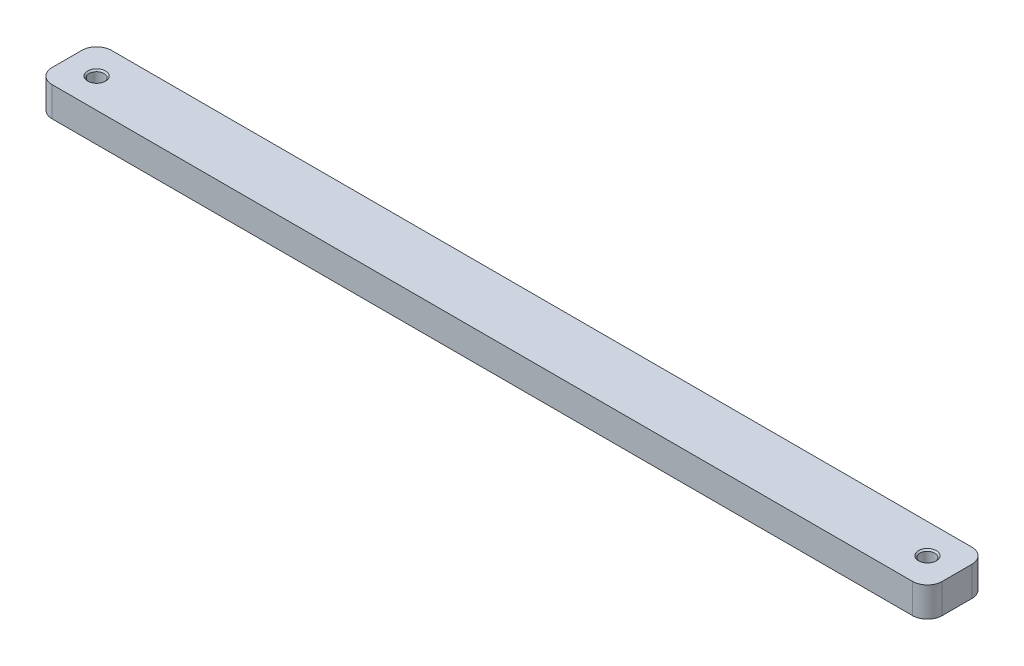
ISO-10303-21;
HEADER;
FILE_DESCRIPTION(('STEP AP214'),'2;1');
FILE_NAME('part.step','',(''),(''),'','','');
FILE_SCHEMA(('AUTOMOTIVE_DESIGN { 1 0 10303 214 1 1 1 1 }'));
ENDSEC;
DATA;
#1=APPLICATION_CONTEXT('core data for automotive mechanical design processes');
#2=APPLICATION_PROTOCOL_DEFINITION('international standard','automotive_design',2000,#1);
#3=PRODUCT_CONTEXT('',#1,'mechanical');
#4=PRODUCT('Part','Part','',(#3));
#5=PRODUCT_RELATED_PRODUCT_CATEGORY('part','',(#4));
#6=PRODUCT_DEFINITION_FORMATION('','',#4);
#7=PRODUCT_DEFINITION_CONTEXT('part definition',#1,'design');
#8=PRODUCT_DEFINITION('design','',#6,#7);
#9=PRODUCT_DEFINITION_SHAPE('','',#8);
#10=(LENGTH_UNIT() NAMED_UNIT(*) SI_UNIT(.MILLI.,.METRE.));
#11=(NAMED_UNIT(*) PLANE_ANGLE_UNIT() SI_UNIT($,.RADIAN.));
#12=(NAMED_UNIT(*) SI_UNIT($,.STERADIAN.) SOLID_ANGLE_UNIT());
#13=UNCERTAINTY_MEASURE_WITH_UNIT(LENGTH_MEASURE(1.E-05),#10,'distance_accuracy_value','');
#14=(GEOMETRIC_REPRESENTATION_CONTEXT(3) GLOBAL_UNCERTAINTY_ASSIGNED_CONTEXT((#13)) GLOBAL_UNIT_ASSIGNED_CONTEXT((#10,
#11,#12)) REPRESENTATION_CONTEXT('',''));
#15=CARTESIAN_POINT('',(0.,0.,0.));
#16=DIRECTION('',(0.,0.,1.));
#17=DIRECTION('',(1.,0.,0.));
#18=AXIS2_PLACEMENT_3D('',#15,#16,#17);
#19=CARTESIAN_POINT('',(150.,10.,-10.));
#20=DIRECTION('',(-1.,0.,0.));
#21=DIRECTION('',(0.,0.,1.));
#22=AXIS2_PLACEMENT_3D('',#19,#20,#21);
#23=PLANE('',#22);
#24=DIRECTION('',(0.,0.,-1.));
#25=VECTOR('',#24,1.);
#26=CARTESIAN_POINT('',(150.,10.,-10.));
#27=LINE('',#26,#25);
#28=CARTESIAN_POINT('',(150.,10.,5.));
#29=VERTEX_POINT('',#28);
#30=CARTESIAN_POINT('',(150.,10.,-5.));
#31=VERTEX_POINT('',#30);
#32=EDGE_CURVE('E122',#29,#31,#27,.T.);
#33=ORIENTED_EDGE('',*,*,#32,.F.);
#34=DIRECTION('',(0.,-1.,0.));
#35=VECTOR('',#34,1.);
#36=CARTESIAN_POINT('',(150.,10.,5.));
#37=LINE('',#36,#35);
#38=CARTESIAN_POINT('',(150.,0.,5.));
#39=VERTEX_POINT('',#38);
#40=EDGE_CURVE('E107',#29,#39,#37,.T.);
#41=ORIENTED_EDGE('',*,*,#40,.T.);
#42=DIRECTION('',(0.,0.,-1.));
#43=VECTOR('',#42,1.);
#44=CARTESIAN_POINT('',(150.,0.,-10.));
#45=LINE('',#44,#43);
#46=CARTESIAN_POINT('',(150.,0.,-5.));
#47=VERTEX_POINT('',#46);
#48=EDGE_CURVE('E119',#39,#47,#45,.T.);
#49=ORIENTED_EDGE('',*,*,#48,.T.);
#50=DIRECTION('',(0.,-1.,0.));
#51=VECTOR('',#50,1.);
#52=CARTESIAN_POINT('',(150.,10.,-5.));
#53=LINE('',#52,#51);
#54=EDGE_CURVE('E124',#47,#31,#53,.F.);
#55=ORIENTED_EDGE('',*,*,#54,.T.);
#56=EDGE_LOOP('',(#33,#41,#49,#55));
#57=FACE_BOUND('',#56,.T.);
#58=ADVANCED_FACE('F37',(#57),#23,.F.);
#59=CARTESIAN_POINT('',(-150.,10.,-10.));
#60=DIRECTION('',(0.,0.,1.));
#61=DIRECTION('',(1.,0.,0.));
#62=AXIS2_PLACEMENT_3D('',#59,#60,#61);
#63=PLANE('',#62);
#64=DIRECTION('',(-1.,0.,0.));
#65=VECTOR('',#64,1.);
#66=CARTESIAN_POINT('',(-150.,10.,-10.));
#67=LINE('',#66,#65);
#68=CARTESIAN_POINT('',(145.,10.,-10.));
#69=VERTEX_POINT('',#68);
#70=CARTESIAN_POINT('',(-145.,10.,-10.));
#71=VERTEX_POINT('',#70);
#72=EDGE_CURVE('E168',#69,#71,#67,.T.);
#73=ORIENTED_EDGE('',*,*,#72,.F.);
#74=DIRECTION('',(0.,-1.,0.));
#75=VECTOR('',#74,1.);
#76=CARTESIAN_POINT('',(145.,10.,-10.));
#77=LINE('',#76,#75);
#78=CARTESIAN_POINT('',(145.,0.,-10.));
#79=VERTEX_POINT('',#78);
#80=EDGE_CURVE('E161',#69,#79,#77,.T.);
#81=ORIENTED_EDGE('',*,*,#80,.T.);
#82=DIRECTION('',(-1.,0.,0.));
#83=VECTOR('',#82,1.);
#84=CARTESIAN_POINT('',(-150.,0.,-10.));
#85=LINE('',#84,#83);
#86=CARTESIAN_POINT('',(-145.,0.,-10.));
#87=VERTEX_POINT('',#86);
#88=EDGE_CURVE('E128',#79,#87,#85,.T.);
#89=ORIENTED_EDGE('',*,*,#88,.T.);
#90=DIRECTION('',(0.,-1.,0.));
#91=VECTOR('',#90,1.);
#92=CARTESIAN_POINT('',(-145.,10.,-10.));
#93=LINE('',#92,#91);
#94=EDGE_CURVE('E159',#87,#71,#93,.F.);
#95=ORIENTED_EDGE('',*,*,#94,.T.);
#96=EDGE_LOOP('',(#73,#81,#89,#95));
#97=FACE_BOUND('',#96,.T.);
#98=ADVANCED_FACE('F166',(#97),#63,.F.);
#99=CARTESIAN_POINT('',(-150.,10.,-10.));
#100=DIRECTION('',(1.,0.,0.));
#101=DIRECTION('',(0.,0.,-1.));
#102=AXIS2_PLACEMENT_3D('',#99,#100,#101);
#103=PLANE('',#102);
#104=DIRECTION('',(0.,0.,1.));
#105=VECTOR('',#104,1.);
#106=CARTESIAN_POINT('',(-150.,10.,-10.));
#107=LINE('',#106,#105);
#108=CARTESIAN_POINT('',(-150.,10.,-5.));
#109=VERTEX_POINT('',#108);
#110=CARTESIAN_POINT('',(-150.,10.,5.));
#111=VERTEX_POINT('',#110);
#112=EDGE_CURVE('E176',#109,#111,#107,.T.);
#113=ORIENTED_EDGE('',*,*,#112,.F.);
#114=DIRECTION('',(0.,-1.,0.));
#115=VECTOR('',#114,1.);
#116=CARTESIAN_POINT('',(-150.,10.,-5.));
#117=LINE('',#116,#115);
#118=CARTESIAN_POINT('',(-150.,0.,-5.));
#119=VERTEX_POINT('',#118);
#120=EDGE_CURVE('E11',#109,#119,#117,.T.);
#121=ORIENTED_EDGE('',*,*,#120,.T.);
#122=DIRECTION('',(0.,0.,1.));
#123=VECTOR('',#122,1.);
#124=CARTESIAN_POINT('',(-150.,0.,-10.));
#125=LINE('',#124,#123);
#126=CARTESIAN_POINT('',(-150.,0.,5.));
#127=VERTEX_POINT('',#126);
#128=EDGE_CURVE('E132',#119,#127,#125,.T.);
#129=ORIENTED_EDGE('',*,*,#128,.T.);
#130=DIRECTION('',(0.,-1.,0.));
#131=VECTOR('',#130,1.);
#132=CARTESIAN_POINT('',(-150.,10.,5.));
#133=LINE('',#132,#131);
#134=EDGE_CURVE('E45',#127,#111,#133,.F.);
#135=ORIENTED_EDGE('',*,*,#134,.T.);
#136=EDGE_LOOP('',(#113,#121,#129,#135));
#137=FACE_BOUND('',#136,.T.);
#138=ADVANCED_FACE('F175',(#137),#103,.F.);
#139=CARTESIAN_POINT('',(-150.,10.,10.));
#140=DIRECTION('',(0.,0.,-1.));
#141=DIRECTION('',(-1.,0.,0.));
#142=AXIS2_PLACEMENT_3D('',#139,#140,#141);
#143=PLANE('',#142);
#144=DIRECTION('',(1.,0.,0.));
#145=VECTOR('',#144,1.);
#146=CARTESIAN_POINT('',(-150.,0.,10.));
#147=LINE('',#146,#145);
#148=CARTESIAN_POINT('',(-145.,0.,10.));
#149=VERTEX_POINT('',#148);
#150=CARTESIAN_POINT('',(145.,0.,10.));
#151=VERTEX_POINT('',#150);
#152=EDGE_CURVE('E142',#149,#151,#147,.T.);
#153=ORIENTED_EDGE('',*,*,#152,.T.);
#154=DIRECTION('',(0.,-1.,0.));
#155=VECTOR('',#154,1.);
#156=CARTESIAN_POINT('',(145.,10.,10.));
#157=LINE('',#156,#155);
#158=CARTESIAN_POINT('',(145.,10.,10.));
#159=VERTEX_POINT('',#158);
#160=EDGE_CURVE('E108',#151,#159,#157,.F.);
#161=ORIENTED_EDGE('',*,*,#160,.T.);
#162=DIRECTION('',(1.,0.,0.));
#163=VECTOR('',#162,1.);
#164=CARTESIAN_POINT('',(-150.,10.,10.));
#165=LINE('',#164,#163);
#166=CARTESIAN_POINT('',(-145.,10.,10.));
#167=VERTEX_POINT('',#166);
#168=EDGE_CURVE('E138',#167,#159,#165,.T.);
#169=ORIENTED_EDGE('',*,*,#168,.F.);
#170=DIRECTION('',(0.,-1.,0.));
#171=VECTOR('',#170,1.);
#172=CARTESIAN_POINT('',(-145.,10.,10.));
#173=LINE('',#172,#171);
#174=EDGE_CURVE('E113',#167,#149,#173,.T.);
#175=ORIENTED_EDGE('',*,*,#174,.T.);
#176=EDGE_LOOP('',(#153,#161,#169,#175));
#177=FACE_BOUND('',#176,.T.);
#178=ADVANCED_FACE('F202',(#177),#143,.F.);
#179=CARTESIAN_POINT('',(0.,10.,0.));
#180=DIRECTION('',(0.,1.,0.));
#181=DIRECTION('',(0.,0.,1.));
#182=AXIS2_PLACEMENT_3D('',#179,#180,#181);
#183=PLANE('',#182);
#184=CARTESIAN_POINT('',(-140.,10.,0.));
#185=DIRECTION('',(0.,1.,0.));
#186=DIRECTION('',(0.,0.,1.));
#187=AXIS2_PLACEMENT_3D('',#184,#185,#186);
#188=CIRCLE('',#187,3.);
#189=CARTESIAN_POINT('',(-140.,10.,3.));
#190=VERTEX_POINT('',#189);
#191=EDGE_CURVE('E193',#190,#190,#188,.T.);
#192=ORIENTED_EDGE('',*,*,#191,.F.);
#193=EDGE_LOOP('',(#192));
#194=FACE_BOUND('',#193,.T.);
#195=CARTESIAN_POINT('',(140.,10.,0.));
#196=DIRECTION('',(0.,1.,0.));
#197=DIRECTION('',(0.,0.,1.));
#198=AXIS2_PLACEMENT_3D('',#195,#196,#197);
#199=CIRCLE('',#198,3.);
#200=CARTESIAN_POINT('',(140.,10.,3.));
#201=VERTEX_POINT('',#200);
#202=EDGE_CURVE('E184',#201,#201,#199,.T.);
#203=ORIENTED_EDGE('',*,*,#202,.F.);
#204=EDGE_LOOP('',(#203));
#205=FACE_BOUND('',#204,.T.);
#206=ORIENTED_EDGE('',*,*,#168,.T.);
#207=CARTESIAN_POINT('',(145.,10.,5.));
#208=DIRECTION('',(0.,1.,0.));
#209=DIRECTION('',(0.,0.,1.));
#210=AXIS2_PLACEMENT_3D('',#207,#208,#209);
#211=CIRCLE('',#210,5.);
#212=EDGE_CURVE('E157',#159,#29,#211,.T.);
#213=ORIENTED_EDGE('',*,*,#212,.T.);
#214=ORIENTED_EDGE('',*,*,#32,.T.);
#215=CARTESIAN_POINT('',(145.,10.,-5.));
#216=DIRECTION('',(0.,1.,0.));
#217=DIRECTION('',(0.,0.,1.));
#218=AXIS2_PLACEMENT_3D('',#215,#216,#217);
#219=CIRCLE('',#218,5.);
#220=EDGE_CURVE('E155',#31,#69,#219,.T.);
#221=ORIENTED_EDGE('',*,*,#220,.T.);
#222=ORIENTED_EDGE('',*,*,#72,.T.);
#223=CARTESIAN_POINT('',(-145.,10.,-5.));
#224=DIRECTION('',(0.,1.,0.));
#225=DIRECTION('',(0.,0.,1.));
#226=AXIS2_PLACEMENT_3D('',#223,#224,#225);
#227=CIRCLE('',#226,5.);
#228=EDGE_CURVE('E58',#71,#109,#227,.T.);
#229=ORIENTED_EDGE('',*,*,#228,.T.);
#230=ORIENTED_EDGE('',*,*,#112,.T.);
#231=CARTESIAN_POINT('',(-145.,10.,5.));
#232=DIRECTION('',(0.,1.,0.));
#233=DIRECTION('',(0.,0.,1.));
#234=AXIS2_PLACEMENT_3D('',#231,#232,#233);
#235=CIRCLE('',#234,5.);
#236=EDGE_CURVE('E152',#111,#167,#235,.T.);
#237=ORIENTED_EDGE('',*,*,#236,.T.);
#238=EDGE_LOOP('',(#206,#213,#214,#221,#222,#229,#230,#237));
#239=FACE_BOUND('',#238,.T.);
#240=ADVANCED_FACE('F199',(#194,#205,#239),#183,.T.);
#241=CARTESIAN_POINT('',(0.,0.,0.));
#242=DIRECTION('',(0.,1.,0.));
#243=DIRECTION('',(0.,0.,1.));
#244=AXIS2_PLACEMENT_3D('',#241,#242,#243);
#245=PLANE('',#244);
#246=CARTESIAN_POINT('',(-140.,0.,0.));
#247=DIRECTION('',(0.,1.,0.));
#248=DIRECTION('',(0.,0.,1.));
#249=AXIS2_PLACEMENT_3D('',#246,#247,#248);
#250=CIRCLE('',#249,2.5);
#251=CARTESIAN_POINT('',(-140.,0.,2.5));
#252=VERTEX_POINT('',#251);
#253=EDGE_CURVE('E187',#252,#252,#250,.T.);
#254=ORIENTED_EDGE('',*,*,#253,.T.);
#255=EDGE_LOOP('',(#254));
#256=FACE_BOUND('',#255,.T.);
#257=CARTESIAN_POINT('',(140.,0.,0.));
#258=DIRECTION('',(0.,1.,0.));
#259=DIRECTION('',(0.,0.,1.));
#260=AXIS2_PLACEMENT_3D('',#257,#258,#259);
#261=CIRCLE('',#260,2.5);
#262=CARTESIAN_POINT('',(140.,0.,2.5));
#263=VERTEX_POINT('',#262);
#264=EDGE_CURVE('E129',#263,#263,#261,.T.);
#265=ORIENTED_EDGE('',*,*,#264,.T.);
#266=EDGE_LOOP('',(#265));
#267=FACE_BOUND('',#266,.T.);
#268=ORIENTED_EDGE('',*,*,#48,.F.);
#269=CARTESIAN_POINT('',(145.,0.,5.));
#270=DIRECTION('',(0.,1.,0.));
#271=DIRECTION('',(0.,0.,1.));
#272=AXIS2_PLACEMENT_3D('',#269,#270,#271);
#273=CIRCLE('',#272,5.);
#274=EDGE_CURVE('E103',#39,#151,#273,.F.);
#275=ORIENTED_EDGE('',*,*,#274,.T.);
#276=ORIENTED_EDGE('',*,*,#152,.F.);
#277=CARTESIAN_POINT('',(-145.,0.,5.));
#278=DIRECTION('',(0.,1.,0.));
#279=DIRECTION('',(0.,0.,1.));
#280=AXIS2_PLACEMENT_3D('',#277,#278,#279);
#281=CIRCLE('',#280,5.);
#282=EDGE_CURVE('E123',#149,#127,#281,.F.);
#283=ORIENTED_EDGE('',*,*,#282,.T.);
#284=ORIENTED_EDGE('',*,*,#128,.F.);
#285=CARTESIAN_POINT('',(-145.,0.,-5.));
#286=DIRECTION('',(0.,1.,0.));
#287=DIRECTION('',(0.,0.,1.));
#288=AXIS2_PLACEMENT_3D('',#285,#286,#287);
#289=CIRCLE('',#288,5.);
#290=EDGE_CURVE('E146',#119,#87,#289,.F.);
#291=ORIENTED_EDGE('',*,*,#290,.T.);
#292=ORIENTED_EDGE('',*,*,#88,.F.);
#293=CARTESIAN_POINT('',(145.,0.,-5.));
#294=DIRECTION('',(0.,1.,0.));
#295=DIRECTION('',(0.,0.,1.));
#296=AXIS2_PLACEMENT_3D('',#293,#294,#295);
#297=CIRCLE('',#296,5.);
#298=EDGE_CURVE('E114',#79,#47,#297,.F.);
#299=ORIENTED_EDGE('',*,*,#298,.T.);
#300=EDGE_LOOP('',(#268,#275,#276,#283,#284,#291,#292,#299));
#301=FACE_BOUND('',#300,.T.);
#302=ADVANCED_FACE('F126',(#256,#267,#301),#245,.F.);
#303=CARTESIAN_POINT('',(140.,10.,0.));
#304=DIRECTION('',(0.,1.,0.));
#305=DIRECTION('',(0.,0.,1.));
#306=AXIS2_PLACEMENT_3D('',#303,#304,#305);
#307=CYLINDRICAL_SURFACE('',#306,2.49999999999999);
#308=ORIENTED_EDGE('',*,*,#264,.F.);
#309=EDGE_LOOP('',(#308));
#310=FACE_BOUND('',#309,.T.);
#311=CARTESIAN_POINT('',(140.,9.49999999999997,0.));
#312=DIRECTION('',(0.,1.,0.));
#313=DIRECTION('',(0.,0.,1.));
#314=AXIS2_PLACEMENT_3D('',#311,#312,#313);
#315=CIRCLE('',#314,2.49999999999997);
#316=CARTESIAN_POINT('',(140.,9.49999999999997,2.49999999999997));
#317=VERTEX_POINT('',#316);
#318=EDGE_CURVE('E135',#317,#317,#315,.T.);
#319=ORIENTED_EDGE('',*,*,#318,.T.);
#320=EDGE_LOOP('',(#319));
#321=FACE_BOUND('',#320,.T.);
#322=ADVANCED_FACE('F273',(#310,#321),#307,.F.);
#323=CARTESIAN_POINT('',(140.,10.,0.));
#324=DIRECTION('',(0.,1.,0.));
#325=DIRECTION('',(0.,0.,1.));
#326=AXIS2_PLACEMENT_3D('',#323,#324,#325);
#327=CONICAL_SURFACE('',#326,3.,0.785398163397447);
#328=ORIENTED_EDGE('',*,*,#318,.F.);
#329=EDGE_LOOP('',(#328));
#330=FACE_BOUND('',#329,.T.);
#331=ORIENTED_EDGE('',*,*,#202,.T.);
#332=EDGE_LOOP('',(#331));
#333=FACE_BOUND('',#332,.T.);
#334=ADVANCED_FACE('F263',(#330,#333),#327,.F.);
#335=CARTESIAN_POINT('',(-140.,10.,0.));
#336=DIRECTION('',(0.,1.,0.));
#337=DIRECTION('',(0.,0.,1.));
#338=AXIS2_PLACEMENT_3D('',#335,#336,#337);
#339=CYLINDRICAL_SURFACE('',#338,2.49999999999999);
#340=ORIENTED_EDGE('',*,*,#253,.F.);
#341=EDGE_LOOP('',(#340));
#342=FACE_BOUND('',#341,.T.);
#343=CARTESIAN_POINT('',(-140.,9.49999999999997,0.));
#344=DIRECTION('',(0.,1.,0.));
#345=DIRECTION('',(0.,0.,1.));
#346=AXIS2_PLACEMENT_3D('',#343,#344,#345);
#347=CIRCLE('',#346,2.49999999999997);
#348=CARTESIAN_POINT('',(-140.,9.49999999999997,2.49999999999997));
#349=VERTEX_POINT('',#348);
#350=EDGE_CURVE('E190',#349,#349,#347,.T.);
#351=ORIENTED_EDGE('',*,*,#350,.T.);
#352=EDGE_LOOP('',(#351));
#353=FACE_BOUND('',#352,.T.);
#354=ADVANCED_FACE('F254',(#342,#353),#339,.F.);
#355=CARTESIAN_POINT('',(-140.,10.,0.));
#356=DIRECTION('',(0.,1.,0.));
#357=DIRECTION('',(0.,0.,1.));
#358=AXIS2_PLACEMENT_3D('',#355,#356,#357);
#359=CONICAL_SURFACE('',#358,3.,0.785398163397447);
#360=ORIENTED_EDGE('',*,*,#350,.F.);
#361=EDGE_LOOP('',(#360));
#362=FACE_BOUND('',#361,.T.);
#363=ORIENTED_EDGE('',*,*,#191,.T.);
#364=EDGE_LOOP('',(#363));
#365=FACE_BOUND('',#364,.T.);
#366=ADVANCED_FACE('F197',(#362,#365),#359,.F.);
#367=CARTESIAN_POINT('',(145.,10.,5.));
#368=DIRECTION('',(0.,-1.,0.));
#369=DIRECTION('',(0.,0.,-1.));
#370=AXIS2_PLACEMENT_3D('',#367,#368,#369);
#371=CYLINDRICAL_SURFACE('',#370,5.);
#372=ORIENTED_EDGE('',*,*,#212,.F.);
#373=ORIENTED_EDGE('',*,*,#160,.F.);
#374=ORIENTED_EDGE('',*,*,#274,.F.);
#375=ORIENTED_EDGE('',*,*,#40,.F.);
#376=EDGE_LOOP('',(#372,#373,#374,#375));
#377=FACE_BOUND('',#376,.T.);
#378=ADVANCED_FACE('F106',(#377),#371,.T.);
#379=CARTESIAN_POINT('',(145.,10.,-5.));
#380=DIRECTION('',(0.,-1.,0.));
#381=DIRECTION('',(0.,0.,-1.));
#382=AXIS2_PLACEMENT_3D('',#379,#380,#381);
#383=CYLINDRICAL_SURFACE('',#382,5.);
#384=ORIENTED_EDGE('',*,*,#220,.F.);
#385=ORIENTED_EDGE('',*,*,#54,.F.);
#386=ORIENTED_EDGE('',*,*,#298,.F.);
#387=ORIENTED_EDGE('',*,*,#80,.F.);
#388=EDGE_LOOP('',(#384,#385,#386,#387));
#389=FACE_BOUND('',#388,.T.);
#390=ADVANCED_FACE('F213',(#389),#383,.T.);
#391=CARTESIAN_POINT('',(-145.,10.,-5.));
#392=DIRECTION('',(0.,-1.,0.));
#393=DIRECTION('',(0.,0.,-1.));
#394=AXIS2_PLACEMENT_3D('',#391,#392,#393);
#395=CYLINDRICAL_SURFACE('',#394,5.);
#396=ORIENTED_EDGE('',*,*,#228,.F.);
#397=ORIENTED_EDGE('',*,*,#94,.F.);
#398=ORIENTED_EDGE('',*,*,#290,.F.);
#399=ORIENTED_EDGE('',*,*,#120,.F.);
#400=EDGE_LOOP('',(#396,#397,#398,#399));
#401=FACE_BOUND('',#400,.T.);
#402=ADVANCED_FACE('F174',(#401),#395,.T.);
#403=CARTESIAN_POINT('',(-145.,10.,5.));
#404=DIRECTION('',(0.,-1.,0.));
#405=DIRECTION('',(0.,0.,-1.));
#406=AXIS2_PLACEMENT_3D('',#403,#404,#405);
#407=CYLINDRICAL_SURFACE('',#406,5.);
#408=ORIENTED_EDGE('',*,*,#236,.F.);
#409=ORIENTED_EDGE('',*,*,#134,.F.);
#410=ORIENTED_EDGE('',*,*,#282,.F.);
#411=ORIENTED_EDGE('',*,*,#174,.F.);
#412=EDGE_LOOP('',(#408,#409,#410,#411));
#413=FACE_BOUND('',#412,.T.);
#414=ADVANCED_FACE('F39',(#413),#407,.T.);
#415=CLOSED_SHELL('',(#58,#98,#138,#178,#240,#302,#322,#334,#354,#366,#378,#390,#402,#414));
#416=MANIFOLD_SOLID_BREP('B2',#415);
#417=ADVANCED_BREP_SHAPE_REPRESENTATION('',(#18,#416),#14);
#418=SHAPE_DEFINITION_REPRESENTATION(#9,#417);
ENDSEC;
END-ISO-10303-21;
